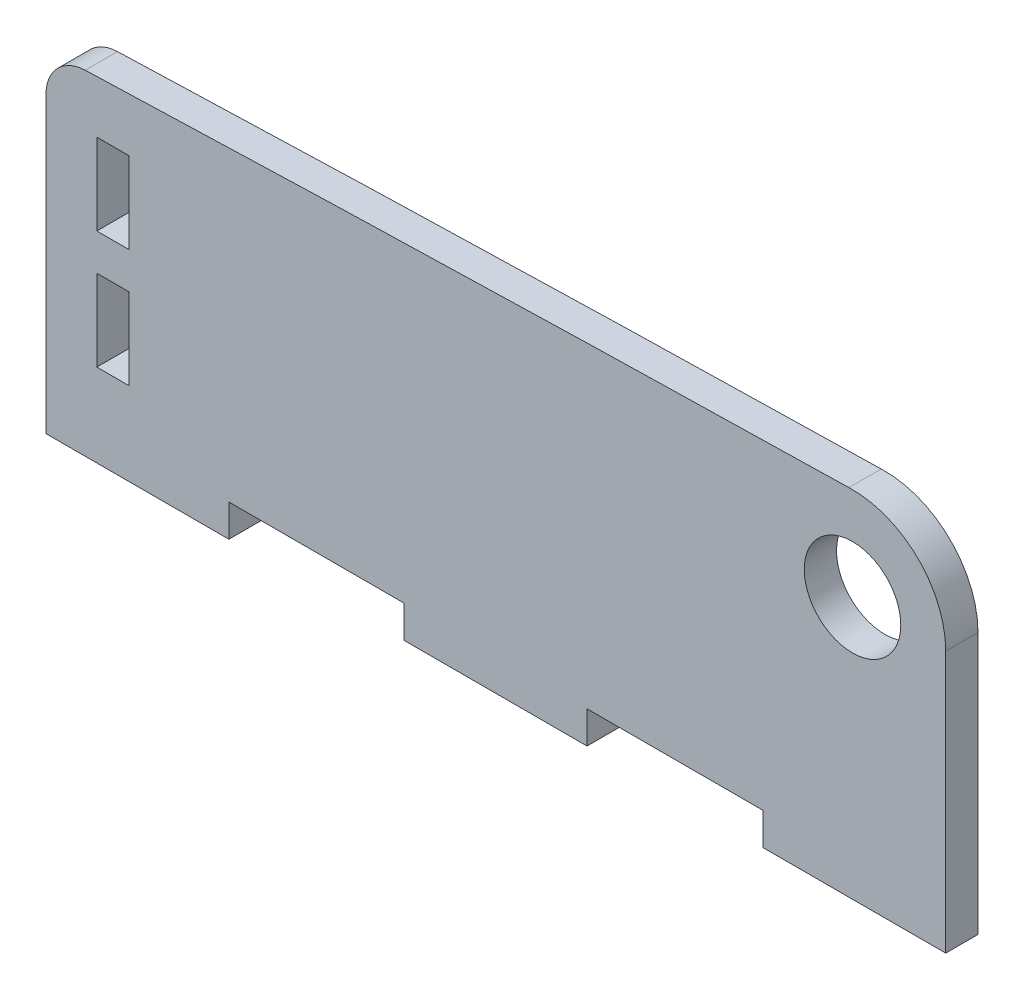
ISO-10303-21;
HEADER;
FILE_DESCRIPTION(('STEP AP214'),'2;1');
FILE_NAME('part.step','',(''),(''),'','','');
FILE_SCHEMA(('AUTOMOTIVE_DESIGN { 1 0 10303 214 1 1 1 1 }'));
ENDSEC;
DATA;
#1=APPLICATION_CONTEXT('core data for automotive mechanical design processes');
#2=APPLICATION_PROTOCOL_DEFINITION('international standard','automotive_design',2000,#1);
#3=PRODUCT_CONTEXT('',#1,'mechanical');
#4=PRODUCT('Part','Part','',(#3));
#5=PRODUCT_RELATED_PRODUCT_CATEGORY('part','',(#4));
#6=PRODUCT_DEFINITION_FORMATION('','',#4);
#7=PRODUCT_DEFINITION_CONTEXT('part definition',#1,'design');
#8=PRODUCT_DEFINITION('design','',#6,#7);
#9=PRODUCT_DEFINITION_SHAPE('','',#8);
#10=(LENGTH_UNIT() NAMED_UNIT(*) SI_UNIT(.MILLI.,.METRE.));
#11=(NAMED_UNIT(*) PLANE_ANGLE_UNIT() SI_UNIT($,.RADIAN.));
#12=(NAMED_UNIT(*) SI_UNIT($,.STERADIAN.) SOLID_ANGLE_UNIT());
#13=UNCERTAINTY_MEASURE_WITH_UNIT(LENGTH_MEASURE(1.E-05),#10,'distance_accuracy_value','');
#14=(GEOMETRIC_REPRESENTATION_CONTEXT(3) GLOBAL_UNCERTAINTY_ASSIGNED_CONTEXT((#13)) GLOBAL_UNIT_ASSIGNED_CONTEXT((#10,
#11,#12)) REPRESENTATION_CONTEXT('',''));
#15=CARTESIAN_POINT('',(0.,0.,0.));
#16=DIRECTION('',(0.,0.,1.));
#17=DIRECTION('',(1.,0.,0.));
#18=AXIS2_PLACEMENT_3D('',#15,#16,#17);
#19=CARTESIAN_POINT('',(26.416,-14.8,3.175));
#20=DIRECTION('',(0.,-1.,0.));
#21=DIRECTION('',(1.,0.,0.));
#22=AXIS2_PLACEMENT_3D('',#19,#20,#21);
#23=PLANE('',#22);
#24=DIRECTION('',(0.,0.,-1.));
#25=VECTOR('',#24,1.);
#26=CARTESIAN_POINT('',(-20.8,-14.8,21.4528725512572));
#27=LINE('',#26,#25);
#28=CARTESIAN_POINT('',(-20.8,-14.8,3.175));
#29=VERTEX_POINT('',#28);
#30=CARTESIAN_POINT('',(-20.8,-14.8,0.));
#31=VERTEX_POINT('',#30);
#32=EDGE_CURVE('E53',#29,#31,#27,.T.);
#33=ORIENTED_EDGE('',*,*,#32,.T.);
#34=DIRECTION('',(-1.,0.,0.));
#35=VECTOR('',#34,1.);
#36=CARTESIAN_POINT('',(26.416,-14.8,0.));
#37=LINE('',#36,#35);
#38=CARTESIAN_POINT('',(-3.55000000000001,-14.8,0.));
#39=VERTEX_POINT('',#38);
#40=EDGE_CURVE('E354',#39,#31,#37,.T.);
#41=ORIENTED_EDGE('',*,*,#40,.F.);
#42=DIRECTION('',(0.,0.,-1.));
#43=VECTOR('',#42,1.);
#44=CARTESIAN_POINT('',(-3.55000000000001,-14.8,21.4528725512572));
#45=LINE('',#44,#43);
#46=CARTESIAN_POINT('',(-3.55000000000001,-14.8,3.175));
#47=VERTEX_POINT('',#46);
#48=EDGE_CURVE('E230',#47,#39,#45,.T.);
#49=ORIENTED_EDGE('',*,*,#48,.F.);
#50=DIRECTION('',(-1.,0.,0.));
#51=VECTOR('',#50,1.);
#52=CARTESIAN_POINT('',(26.416,-14.8,3.175));
#53=LINE('',#52,#51);
#54=EDGE_CURVE('E58',#47,#29,#53,.T.);
#55=ORIENTED_EDGE('',*,*,#54,.T.);
#56=EDGE_LOOP('',(#33,#41,#49,#55));
#57=FACE_BOUND('',#56,.T.);
#58=ADVANCED_FACE('F38',(#57),#23,.T.);
#59=CARTESIAN_POINT('',(40.576,7.77,15.1599874843489));
#60=DIRECTION('',(0.,0.,-1.));
#61=DIRECTION('',(-1.,0.,0.));
#62=AXIS2_PLACEMENT_3D('',#59,#60,#61);
#63=CYLINDRICAL_SURFACE('',#62,9.17500000000001);
#64=CARTESIAN_POINT('',(40.576,7.77,0.));
#65=DIRECTION('',(0.,0.,-1.));
#66=DIRECTION('',(-1.,0.,0.));
#67=AXIS2_PLACEMENT_3D('',#64,#65,#66);
#68=CIRCLE('',#67,9.17500000000001);
#69=CARTESIAN_POINT('',(40.2258480765746,16.9383160193419,0.));
#70=VERTEX_POINT('',#69);
#71=CARTESIAN_POINT('',(49.751,7.77,0.));
#72=VERTEX_POINT('',#71);
#73=EDGE_CURVE('E340',#70,#72,#68,.T.);
#74=ORIENTED_EDGE('',*,*,#73,.F.);
#75=DIRECTION('',(0.,0.,-1.));
#76=VECTOR('',#75,1.);
#77=CARTESIAN_POINT('',(40.2258480765746,16.9383160193419,82.2297725290536));
#78=LINE('',#77,#76);
#79=CARTESIAN_POINT('',(40.2258480765746,16.9383160193419,3.175));
#80=VERTEX_POINT('',#79);
#81=EDGE_CURVE('E262',#80,#70,#78,.T.);
#82=ORIENTED_EDGE('',*,*,#81,.F.);
#83=CARTESIAN_POINT('',(40.576,7.77,3.175));
#84=DIRECTION('',(0.,0.,1.));
#85=DIRECTION('',(1.,0.,0.));
#86=AXIS2_PLACEMENT_3D('',#83,#84,#85);
#87=CIRCLE('',#86,9.17500000000001);
#88=CARTESIAN_POINT('',(49.751,7.77,3.175));
#89=VERTEX_POINT('',#88);
#90=EDGE_CURVE('E342',#80,#89,#87,.F.);
#91=ORIENTED_EDGE('',*,*,#90,.T.);
#92=DIRECTION('',(0.,0.,-1.));
#93=VECTOR('',#92,1.);
#94=CARTESIAN_POINT('',(49.751,7.77,10.));
#95=LINE('',#94,#93);
#96=EDGE_CURVE('E334',#89,#72,#95,.T.);
#97=ORIENTED_EDGE('',*,*,#96,.T.);
#98=EDGE_LOOP('',(#74,#82,#91,#97));
#99=FACE_BOUND('',#98,.T.);
#100=ADVANCED_FACE('F403',(#99),#63,.T.);
#101=CARTESIAN_POINT('',(-30.625,0.,33.0727537785032));
#102=DIRECTION('',(1.,0.,0.));
#103=DIRECTION('',(0.,1.,0.));
#104=AXIS2_PLACEMENT_3D('',#101,#102,#103);
#105=PLANE('',#104);
#106=DIRECTION('',(0.,0.,-1.));
#107=VECTOR('',#106,1.);
#108=CARTESIAN_POINT('',(-30.625,-9.79999999999999,33.8831524191867));
#109=LINE('',#108,#107);
#110=CARTESIAN_POINT('',(-30.625,-9.79999999999999,3.175));
#111=VERTEX_POINT('',#110);
#112=CARTESIAN_POINT('',(-30.625,-9.79999999999999,0.));
#113=VERTEX_POINT('',#112);
#114=EDGE_CURVE('E279',#111,#113,#109,.T.);
#115=ORIENTED_EDGE('',*,*,#114,.F.);
#116=DIRECTION('',(0.,-1.,0.));
#117=VECTOR('',#116,1.);
#118=CARTESIAN_POINT('',(-30.625,0.,3.175));
#119=LINE('',#118,#117);
#120=CARTESIAN_POINT('',(-30.625,-1.79999999999999,3.175));
#121=VERTEX_POINT('',#120);
#122=EDGE_CURVE('E328',#121,#111,#119,.T.);
#123=ORIENTED_EDGE('',*,*,#122,.F.);
#124=DIRECTION('',(0.,0.,-1.));
#125=VECTOR('',#124,1.);
#126=CARTESIAN_POINT('',(-30.625,-1.79999999999999,33.8831524191867));
#127=LINE('',#126,#125);
#128=CARTESIAN_POINT('',(-30.625,-1.79999999999999,0.));
#129=VERTEX_POINT('',#128);
#130=EDGE_CURVE('E317',#121,#129,#127,.T.);
#131=ORIENTED_EDGE('',*,*,#130,.T.);
#132=DIRECTION('',(0.,-1.,0.));
#133=VECTOR('',#132,1.);
#134=CARTESIAN_POINT('',(-30.625,0.,0.));
#135=LINE('',#134,#133);
#136=EDGE_CURVE('E306',#129,#113,#135,.T.);
#137=ORIENTED_EDGE('',*,*,#136,.T.);
#138=EDGE_LOOP('',(#115,#123,#131,#137));
#139=FACE_BOUND('',#138,.T.);
#140=ADVANCED_FACE('F405',(#139),#105,.F.);
#141=DIRECTION('',(0.,0.,-1.));
#142=VECTOR('',#141,1.);
#143=CARTESIAN_POINT('',(-30.625,1.8,33.8831524191867));
#144=LINE('',#143,#142);
#145=CARTESIAN_POINT('',(-30.625,1.8,3.175));
#146=VERTEX_POINT('',#145);
#147=CARTESIAN_POINT('',(-30.625,1.8,0.));
#148=VERTEX_POINT('',#147);
#149=EDGE_CURVE('E290',#146,#148,#144,.T.);
#150=ORIENTED_EDGE('',*,*,#149,.F.);
#151=CARTESIAN_POINT('',(-30.625,9.8,3.175));
#152=VERTEX_POINT('',#151);
#153=EDGE_CURVE('E331',#152,#146,#119,.T.);
#154=ORIENTED_EDGE('',*,*,#153,.F.);
#155=DIRECTION('',(0.,0.,-1.));
#156=VECTOR('',#155,1.);
#157=CARTESIAN_POINT('',(-30.625,9.8,33.8831524191867));
#158=LINE('',#157,#156);
#159=CARTESIAN_POINT('',(-30.625,9.8,0.));
#160=VERTEX_POINT('',#159);
#161=EDGE_CURVE('E296',#152,#160,#158,.T.);
#162=ORIENTED_EDGE('',*,*,#161,.T.);
#163=EDGE_CURVE('E327',#160,#148,#135,.T.);
#164=ORIENTED_EDGE('',*,*,#163,.T.);
#165=EDGE_LOOP('',(#150,#154,#162,#164));
#166=FACE_BOUND('',#165,.T.);
#167=ADVANCED_FACE('F411',(#166),#105,.F.);
#168=CARTESIAN_POINT('',(0.,0.,0.));
#169=DIRECTION('',(0.,0.,1.));
#170=DIRECTION('',(1.,0.,0.));
#171=AXIS2_PLACEMENT_3D('',#168,#169,#170);
#172=PLANE('',#171);
#173=DIRECTION('',(-1.,0.,0.));
#174=VECTOR('',#173,1.);
#175=CARTESIAN_POINT('',(0.,-9.79999999999999,0.));
#176=LINE('',#175,#174);
#177=CARTESIAN_POINT('',(-33.8,-9.79999999999999,0.));
#178=VERTEX_POINT('',#177);
#179=EDGE_CURVE('E275',#113,#178,#176,.T.);
#180=ORIENTED_EDGE('',*,*,#179,.F.);
#181=ORIENTED_EDGE('',*,*,#136,.F.);
#182=DIRECTION('',(-1.,0.,0.));
#183=VECTOR('',#182,1.);
#184=CARTESIAN_POINT('',(0.,-1.79999999999999,0.));
#185=LINE('',#184,#183);
#186=CARTESIAN_POINT('',(-33.8,-1.79999999999999,0.));
#187=VERTEX_POINT('',#186);
#188=EDGE_CURVE('E282',#129,#187,#185,.T.);
#189=ORIENTED_EDGE('',*,*,#188,.T.);
#190=DIRECTION('',(0.,-1.,0.));
#191=VECTOR('',#190,1.);
#192=CARTESIAN_POINT('',(-33.8,0.,0.));
#193=LINE('',#192,#191);
#194=EDGE_CURVE('E197',#187,#178,#193,.T.);
#195=ORIENTED_EDGE('',*,*,#194,.T.);
#196=EDGE_LOOP('',(#180,#181,#189,#195));
#197=FACE_BOUND('',#196,.T.);
#198=DIRECTION('',(-1.,0.,0.));
#199=VECTOR('',#198,1.);
#200=CARTESIAN_POINT('',(0.,1.8,0.));
#201=LINE('',#200,#199);
#202=CARTESIAN_POINT('',(-33.8,1.8,0.));
#203=VERTEX_POINT('',#202);
#204=EDGE_CURVE('E286',#148,#203,#201,.T.);
#205=ORIENTED_EDGE('',*,*,#204,.F.);
#206=ORIENTED_EDGE('',*,*,#163,.F.);
#207=DIRECTION('',(-1.,0.,0.));
#208=VECTOR('',#207,1.);
#209=CARTESIAN_POINT('',(0.,9.8,0.));
#210=LINE('',#209,#208);
#211=CARTESIAN_POINT('',(-33.8,9.8,0.));
#212=VERTEX_POINT('',#211);
#213=EDGE_CURVE('E293',#160,#212,#210,.T.);
#214=ORIENTED_EDGE('',*,*,#213,.T.);
#215=DIRECTION('',(0.,-1.,0.));
#216=VECTOR('',#215,1.);
#217=CARTESIAN_POINT('',(-33.8,0.,0.));
#218=LINE('',#217,#216);
#219=EDGE_CURVE('E285',#212,#203,#218,.T.);
#220=ORIENTED_EDGE('',*,*,#219,.T.);
#221=EDGE_LOOP('',(#205,#206,#214,#220));
#222=FACE_BOUND('',#221,.T.);
#223=CARTESIAN_POINT('',(40.576,7.77,0.));
#224=DIRECTION('',(0.,0.,-1.));
#225=DIRECTION('',(-1.,0.,0.));
#226=AXIS2_PLACEMENT_3D('',#223,#224,#225);
#227=CIRCLE('',#226,4.75);
#228=CARTESIAN_POINT('',(35.826,7.77,0.));
#229=VERTEX_POINT('',#228);
#230=EDGE_CURVE('E344',#229,#229,#227,.T.);
#231=ORIENTED_EDGE('',*,*,#230,.F.);
#232=EDGE_LOOP('',(#231));
#233=FACE_BOUND('',#232,.T.);
#234=DIRECTION('',(0.,-1.,0.));
#235=VECTOR('',#234,1.);
#236=CARTESIAN_POINT('',(-38.8,0.,0.));
#237=LINE('',#236,#235);
#238=CARTESIAN_POINT('',(-38.8,10.9360380146031,0.));
#239=VERTEX_POINT('',#238);
#240=CARTESIAN_POINT('',(-38.8,-17.975,0.));
#241=VERTEX_POINT('',#240);
#242=EDGE_CURVE('E203',#239,#241,#237,.T.);
#243=ORIENTED_EDGE('',*,*,#242,.F.);
#244=CARTESIAN_POINT('',(-34.8,10.9360380146031,0.));
#245=DIRECTION('',(0.,0.,1.));
#246=DIRECTION('',(1.,0.,0.));
#247=AXIS2_PLACEMENT_3D('',#244,#245,#246);
#248=CIRCLE('',#247,4.);
#249=CARTESIAN_POINT('',(-34.9367995007202,14.9336980672583,0.));
#250=VERTEX_POINT('',#249);
#251=EDGE_CURVE('E358',#239,#250,#248,.F.);
#252=ORIENTED_EDGE('',*,*,#251,.T.);
#253=CARTESIAN_POINT('',(135.530776045635,-4966.60068946307,0.));
#254=DIRECTION('',(0.,0.,-1.));
#255=DIRECTION('',(-1.,0.,0.));
#256=AXIS2_PLACEMENT_3D('',#253,#254,#255);
#257=CIRCLE('',#256,4984.45022529665);
#258=EDGE_CURVE('E269',#70,#250,#257,.F.);
#259=ORIENTED_EDGE('',*,*,#258,.F.);
#260=ORIENTED_EDGE('',*,*,#73,.T.);
#261=DIRECTION('',(0.,-1.,0.));
#262=VECTOR('',#261,1.);
#263=CARTESIAN_POINT('',(49.751,0.,0.));
#264=LINE('',#263,#262);
#265=CARTESIAN_POINT('',(49.751,-17.975,0.));
#266=VERTEX_POINT('',#265);
#267=EDGE_CURVE('E332',#72,#266,#264,.T.);
#268=ORIENTED_EDGE('',*,*,#267,.T.);
#269=DIRECTION('',(-1.,0.,0.));
#270=VECTOR('',#269,1.);
#271=CARTESIAN_POINT('',(49.751,-17.975,0.));
#272=LINE('',#271,#270);
#273=CARTESIAN_POINT('',(31.751,-17.975,0.));
#274=VERTEX_POINT('',#273);
#275=EDGE_CURVE('E252',#266,#274,#272,.T.);
#276=ORIENTED_EDGE('',*,*,#275,.T.);
#277=DIRECTION('',(0.,-1.,0.));
#278=VECTOR('',#277,1.);
#279=CARTESIAN_POINT('',(31.751,-14.8,0.));
#280=LINE('',#279,#278);
#281=CARTESIAN_POINT('',(31.751,-14.8,0.));
#282=VERTEX_POINT('',#281);
#283=EDGE_CURVE('E249',#282,#274,#280,.T.);
#284=ORIENTED_EDGE('',*,*,#283,.F.);
#285=CARTESIAN_POINT('',(14.45,-14.8,0.));
#286=VERTEX_POINT('',#285);
#287=EDGE_CURVE('E351',#282,#286,#37,.T.);
#288=ORIENTED_EDGE('',*,*,#287,.T.);
#289=DIRECTION('',(0.,-1.,0.));
#290=VECTOR('',#289,1.);
#291=CARTESIAN_POINT('',(14.45,-14.8,0.));
#292=LINE('',#291,#290);
#293=CARTESIAN_POINT('',(14.45,-17.975,0.));
#294=VERTEX_POINT('',#293);
#295=EDGE_CURVE('E215',#286,#294,#292,.T.);
#296=ORIENTED_EDGE('',*,*,#295,.T.);
#297=DIRECTION('',(-1.,0.,0.));
#298=VECTOR('',#297,1.);
#299=CARTESIAN_POINT('',(14.45,-17.975,0.));
#300=LINE('',#299,#298);
#301=CARTESIAN_POINT('',(-3.55000000000001,-17.975,0.));
#302=VERTEX_POINT('',#301);
#303=EDGE_CURVE('E242',#294,#302,#300,.T.);
#304=ORIENTED_EDGE('',*,*,#303,.T.);
#305=DIRECTION('',(0.,-1.,0.));
#306=VECTOR('',#305,1.);
#307=CARTESIAN_POINT('',(-3.55000000000001,-14.8,0.));
#308=LINE('',#307,#306);
#309=EDGE_CURVE('E234',#39,#302,#308,.T.);
#310=ORIENTED_EDGE('',*,*,#309,.F.);
#311=ORIENTED_EDGE('',*,*,#40,.T.);
#312=DIRECTION('',(0.,-1.,0.));
#313=VECTOR('',#312,1.);
#314=CARTESIAN_POINT('',(-20.8,-14.8,0.));
#315=LINE('',#314,#313);
#316=CARTESIAN_POINT('',(-20.8,-17.975,0.));
#317=VERTEX_POINT('',#316);
#318=EDGE_CURVE('E223',#31,#317,#315,.T.);
#319=ORIENTED_EDGE('',*,*,#318,.T.);
#320=DIRECTION('',(-1.,0.,0.));
#321=VECTOR('',#320,1.);
#322=CARTESIAN_POINT('',(-20.8,-17.975,0.));
#323=LINE('',#322,#321);
#324=EDGE_CURVE('E221',#317,#241,#323,.T.);
#325=ORIENTED_EDGE('',*,*,#324,.T.);
#326=EDGE_LOOP('',(#243,#252,#259,#260,#268,#276,#284,#288,#296,#304,#310,#311,#319,#325));
#327=FACE_BOUND('',#326,.T.);
#328=ADVANCED_FACE('F367',(#197,#222,#233,#327),#172,.F.);
#329=CARTESIAN_POINT('',(0.,0.,3.175));
#330=DIRECTION('',(0.,0.,1.));
#331=DIRECTION('',(1.,0.,0.));
#332=AXIS2_PLACEMENT_3D('',#329,#330,#331);
#333=PLANE('',#332);
#334=DIRECTION('',(-1.,0.,0.));
#335=VECTOR('',#334,1.);
#336=CARTESIAN_POINT('',(0.,9.8,3.175));
#337=LINE('',#336,#335);
#338=CARTESIAN_POINT('',(-33.8,9.8,3.175));
#339=VERTEX_POINT('',#338);
#340=EDGE_CURVE('E298',#152,#339,#337,.T.);
#341=ORIENTED_EDGE('',*,*,#340,.F.);
#342=ORIENTED_EDGE('',*,*,#153,.T.);
#343=DIRECTION('',(-1.,0.,0.));
#344=VECTOR('',#343,1.);
#345=CARTESIAN_POINT('',(0.,1.8,3.175));
#346=LINE('',#345,#344);
#347=CARTESIAN_POINT('',(-33.8,1.8,3.175));
#348=VERTEX_POINT('',#347);
#349=EDGE_CURVE('E303',#146,#348,#346,.T.);
#350=ORIENTED_EDGE('',*,*,#349,.T.);
#351=DIRECTION('',(0.,-1.,0.));
#352=VECTOR('',#351,1.);
#353=CARTESIAN_POINT('',(-33.8,0.,3.175));
#354=LINE('',#353,#352);
#355=EDGE_CURVE('E289',#339,#348,#354,.T.);
#356=ORIENTED_EDGE('',*,*,#355,.F.);
#357=EDGE_LOOP('',(#341,#342,#350,#356));
#358=FACE_BOUND('',#357,.T.);
#359=CARTESIAN_POINT('',(135.530776045635,-4966.60068946307,3.175));
#360=DIRECTION('',(0.,0.,1.));
#361=DIRECTION('',(1.,0.,0.));
#362=AXIS2_PLACEMENT_3D('',#359,#360,#361);
#363=CIRCLE('',#362,4984.45022529665);
#364=CARTESIAN_POINT('',(-34.9367995007202,14.9336980672583,3.175));
#365=VERTEX_POINT('',#364);
#366=EDGE_CURVE('E272',#80,#365,#363,.T.);
#367=ORIENTED_EDGE('',*,*,#366,.T.);
#368=CARTESIAN_POINT('',(-34.8,10.9360380146031,3.175));
#369=DIRECTION('',(0.,0.,1.));
#370=DIRECTION('',(1.,0.,0.));
#371=AXIS2_PLACEMENT_3D('',#368,#369,#370);
#372=CIRCLE('',#371,4.);
#373=CARTESIAN_POINT('',(-38.8,10.9360380146031,3.175));
#374=VERTEX_POINT('',#373);
#375=EDGE_CURVE('E11',#365,#374,#372,.T.);
#376=ORIENTED_EDGE('',*,*,#375,.T.);
#377=DIRECTION('',(0.,-1.,0.));
#378=VECTOR('',#377,1.);
#379=CARTESIAN_POINT('',(-38.8,0.,3.175));
#380=LINE('',#379,#378);
#381=CARTESIAN_POINT('',(-38.8,-17.975,3.175));
#382=VERTEX_POINT('',#381);
#383=EDGE_CURVE('E184',#374,#382,#380,.T.);
#384=ORIENTED_EDGE('',*,*,#383,.T.);
#385=DIRECTION('',(-1.,0.,0.));
#386=VECTOR('',#385,1.);
#387=CARTESIAN_POINT('',(-20.8,-17.975,3.175));
#388=LINE('',#387,#386);
#389=CARTESIAN_POINT('',(-20.8,-17.975,3.175));
#390=VERTEX_POINT('',#389);
#391=EDGE_CURVE('E191',#390,#382,#388,.T.);
#392=ORIENTED_EDGE('',*,*,#391,.F.);
#393=DIRECTION('',(0.,-1.,0.));
#394=VECTOR('',#393,1.);
#395=CARTESIAN_POINT('',(-20.8,-14.8,3.175));
#396=LINE('',#395,#394);
#397=EDGE_CURVE('E207',#29,#390,#396,.T.);
#398=ORIENTED_EDGE('',*,*,#397,.F.);
#399=ORIENTED_EDGE('',*,*,#54,.F.);
#400=DIRECTION('',(0.,-1.,0.));
#401=VECTOR('',#400,1.);
#402=CARTESIAN_POINT('',(-3.55000000000001,-14.8,3.175));
#403=LINE('',#402,#401);
#404=CARTESIAN_POINT('',(-3.55000000000001,-17.975,3.175));
#405=VERTEX_POINT('',#404);
#406=EDGE_CURVE('E212',#47,#405,#403,.T.);
#407=ORIENTED_EDGE('',*,*,#406,.T.);
#408=DIRECTION('',(-1.,0.,0.));
#409=VECTOR('',#408,1.);
#410=CARTESIAN_POINT('',(14.45,-17.975,3.175));
#411=LINE('',#410,#409);
#412=CARTESIAN_POINT('',(14.45,-17.975,3.175));
#413=VERTEX_POINT('',#412);
#414=EDGE_CURVE('E228',#413,#405,#411,.T.);
#415=ORIENTED_EDGE('',*,*,#414,.F.);
#416=DIRECTION('',(0.,-1.,0.));
#417=VECTOR('',#416,1.);
#418=CARTESIAN_POINT('',(14.45,-14.8,3.175));
#419=LINE('',#418,#417);
#420=CARTESIAN_POINT('',(14.45,-14.8,3.175));
#421=VERTEX_POINT('',#420);
#422=EDGE_CURVE('E229',#421,#413,#419,.T.);
#423=ORIENTED_EDGE('',*,*,#422,.F.);
#424=CARTESIAN_POINT('',(31.751,-14.8,3.175));
#425=VERTEX_POINT('',#424);
#426=EDGE_CURVE('E348',#425,#421,#53,.T.);
#427=ORIENTED_EDGE('',*,*,#426,.F.);
#428=DIRECTION('',(0.,-1.,0.));
#429=VECTOR('',#428,1.);
#430=CARTESIAN_POINT('',(31.751,-14.8,3.175));
#431=LINE('',#430,#429);
#432=CARTESIAN_POINT('',(31.751,-17.975,3.175));
#433=VERTEX_POINT('',#432);
#434=EDGE_CURVE('E256',#425,#433,#431,.T.);
#435=ORIENTED_EDGE('',*,*,#434,.T.);
#436=DIRECTION('',(-1.,0.,0.));
#437=VECTOR('',#436,1.);
#438=CARTESIAN_POINT('',(49.751,-17.975,3.175));
#439=LINE('',#438,#437);
#440=CARTESIAN_POINT('',(49.751,-17.975,3.175));
#441=VERTEX_POINT('',#440);
#442=EDGE_CURVE('E240',#441,#433,#439,.T.);
#443=ORIENTED_EDGE('',*,*,#442,.F.);
#444=DIRECTION('',(0.,1.,0.));
#445=VECTOR('',#444,1.);
#446=CARTESIAN_POINT('',(49.751,0.,3.175));
#447=LINE('',#446,#445);
#448=EDGE_CURVE('E337',#441,#89,#447,.T.);
#449=ORIENTED_EDGE('',*,*,#448,.T.);
#450=ORIENTED_EDGE('',*,*,#90,.F.);
#451=EDGE_LOOP('',(#367,#376,#384,#392,#398,#399,#407,#415,#423,#427,#435,#443,#449,#450));
#452=FACE_BOUND('',#451,.T.);
#453=CARTESIAN_POINT('',(40.576,7.77,3.175));
#454=DIRECTION('',(0.,0.,1.));
#455=DIRECTION('',(1.,0.,0.));
#456=AXIS2_PLACEMENT_3D('',#453,#454,#455);
#457=CIRCLE('',#456,4.75);
#458=CARTESIAN_POINT('',(45.326,7.77,3.175));
#459=VERTEX_POINT('',#458);
#460=EDGE_CURVE('E347',#459,#459,#457,.T.);
#461=ORIENTED_EDGE('',*,*,#460,.F.);
#462=EDGE_LOOP('',(#461));
#463=FACE_BOUND('',#462,.T.);
#464=DIRECTION('',(-1.,0.,0.));
#465=VECTOR('',#464,1.);
#466=CARTESIAN_POINT('',(0.,-1.79999999999999,3.175));
#467=LINE('',#466,#465);
#468=CARTESIAN_POINT('',(-33.8,-1.79999999999999,3.175));
#469=VERTEX_POINT('',#468);
#470=EDGE_CURVE('E307',#121,#469,#467,.T.);
#471=ORIENTED_EDGE('',*,*,#470,.F.);
#472=ORIENTED_EDGE('',*,*,#122,.T.);
#473=DIRECTION('',(-1.,0.,0.));
#474=VECTOR('',#473,1.);
#475=CARTESIAN_POINT('',(0.,-9.79999999999999,3.175));
#476=LINE('',#475,#474);
#477=CARTESIAN_POINT('',(-33.8,-9.79999999999999,3.175));
#478=VERTEX_POINT('',#477);
#479=EDGE_CURVE('E196',#111,#478,#476,.T.);
#480=ORIENTED_EDGE('',*,*,#479,.T.);
#481=DIRECTION('',(0.,-1.,0.));
#482=VECTOR('',#481,1.);
#483=CARTESIAN_POINT('',(-33.8,0.,3.175));
#484=LINE('',#483,#482);
#485=EDGE_CURVE('E278',#469,#478,#484,.T.);
#486=ORIENTED_EDGE('',*,*,#485,.F.);
#487=EDGE_LOOP('',(#471,#472,#480,#486));
#488=FACE_BOUND('',#487,.T.);
#489=ADVANCED_FACE('F187',(#358,#452,#463,#488),#333,.T.);
#490=DIRECTION('',(0.,0.,-1.));
#491=VECTOR('',#490,1.);
#492=CARTESIAN_POINT('',(14.45,-14.8,21.4528725512572));
#493=LINE('',#492,#491);
#494=EDGE_CURVE('E233',#421,#286,#493,.T.);
#495=ORIENTED_EDGE('',*,*,#494,.T.);
#496=ORIENTED_EDGE('',*,*,#287,.F.);
#497=DIRECTION('',(0.,0.,-1.));
#498=VECTOR('',#497,1.);
#499=CARTESIAN_POINT('',(31.751,-14.8,21.4528725512572));
#500=LINE('',#499,#498);
#501=EDGE_CURVE('E253',#425,#282,#500,.T.);
#502=ORIENTED_EDGE('',*,*,#501,.F.);
#503=ORIENTED_EDGE('',*,*,#426,.T.);
#504=EDGE_LOOP('',(#495,#496,#502,#503));
#505=FACE_BOUND('',#504,.T.);
#506=ADVANCED_FACE('F388',(#505),#23,.T.);
#507=CARTESIAN_POINT('',(40.576,7.77,10.));
#508=DIRECTION('',(0.,0.,-1.));
#509=DIRECTION('',(-1.,0.,0.));
#510=AXIS2_PLACEMENT_3D('',#507,#508,#509);
#511=CYLINDRICAL_SURFACE('',#510,4.75);
#512=ORIENTED_EDGE('',*,*,#460,.T.);
#513=EDGE_LOOP('',(#512));
#514=FACE_BOUND('',#513,.T.);
#515=ORIENTED_EDGE('',*,*,#230,.T.);
#516=EDGE_LOOP('',(#515));
#517=FACE_BOUND('',#516,.T.);
#518=ADVANCED_FACE('F416',(#514,#517),#511,.F.);
#519=CARTESIAN_POINT('',(49.751,0.,10.));
#520=DIRECTION('',(1.,0.,0.));
#521=DIRECTION('',(0.,0.,-1.));
#522=AXIS2_PLACEMENT_3D('',#519,#520,#521);
#523=PLANE('',#522);
#524=ORIENTED_EDGE('',*,*,#448,.F.);
#525=DIRECTION('',(0.,0.,-1.));
#526=VECTOR('',#525,1.);
#527=CARTESIAN_POINT('',(49.751,-17.975,21.4528725512572));
#528=LINE('',#527,#526);
#529=EDGE_CURVE('E263',#441,#266,#528,.T.);
#530=ORIENTED_EDGE('',*,*,#529,.T.);
#531=ORIENTED_EDGE('',*,*,#267,.F.);
#532=ORIENTED_EDGE('',*,*,#96,.F.);
#533=EDGE_LOOP('',(#524,#530,#531,#532));
#534=FACE_BOUND('',#533,.T.);
#535=ADVANCED_FACE('F399',(#534),#523,.T.);
#536=CARTESIAN_POINT('',(-38.8,0.,33.8831524191867));
#537=DIRECTION('',(1.,0.,0.));
#538=DIRECTION('',(0.,1.,0.));
#539=AXIS2_PLACEMENT_3D('',#536,#537,#538);
#540=PLANE('',#539);
#541=ORIENTED_EDGE('',*,*,#383,.F.);
#542=DIRECTION('',(0.,0.,-1.));
#543=VECTOR('',#542,1.);
#544=CARTESIAN_POINT('',(-38.8,10.9360380146031,33.8831524191867));
#545=LINE('',#544,#543);
#546=EDGE_CURVE('E350',#374,#239,#545,.T.);
#547=ORIENTED_EDGE('',*,*,#546,.T.);
#548=ORIENTED_EDGE('',*,*,#242,.T.);
#549=DIRECTION('',(0.,0.,-1.));
#550=VECTOR('',#549,1.);
#551=CARTESIAN_POINT('',(-38.8,-17.975,21.4528725512572));
#552=LINE('',#551,#550);
#553=EDGE_CURVE('E200',#382,#241,#552,.T.);
#554=ORIENTED_EDGE('',*,*,#553,.F.);
#555=EDGE_LOOP('',(#541,#547,#548,#554));
#556=FACE_BOUND('',#555,.T.);
#557=ADVANCED_FACE('F201',(#556),#540,.F.);
#558=CARTESIAN_POINT('',(0.,-9.79999999999999,33.8831524191867));
#559=DIRECTION('',(0.,-1.,0.));
#560=DIRECTION('',(0.,0.,-1.));
#561=AXIS2_PLACEMENT_3D('',#558,#559,#560);
#562=PLANE('',#561);
#563=ORIENTED_EDGE('',*,*,#479,.F.);
#564=ORIENTED_EDGE('',*,*,#114,.T.);
#565=ORIENTED_EDGE('',*,*,#179,.T.);
#566=DIRECTION('',(0.,0.,-1.));
#567=VECTOR('',#566,1.);
#568=CARTESIAN_POINT('',(-33.8,-9.79999999999999,33.8831524191867));
#569=LINE('',#568,#567);
#570=EDGE_CURVE('E310',#478,#178,#569,.T.);
#571=ORIENTED_EDGE('',*,*,#570,.F.);
#572=EDGE_LOOP('',(#563,#564,#565,#571));
#573=FACE_BOUND('',#572,.T.);
#574=ADVANCED_FACE('F447',(#573),#562,.F.);
#575=CARTESIAN_POINT('',(-33.8,0.,33.8831524191867));
#576=DIRECTION('',(1.,0.,0.));
#577=DIRECTION('',(0.,0.,-1.));
#578=AXIS2_PLACEMENT_3D('',#575,#576,#577);
#579=PLANE('',#578);
#580=DIRECTION('',(0.,0.,-1.));
#581=VECTOR('',#580,1.);
#582=CARTESIAN_POINT('',(-33.8,-1.79999999999999,33.8831524191867));
#583=LINE('',#582,#581);
#584=EDGE_CURVE('E309',#469,#187,#583,.T.);
#585=ORIENTED_EDGE('',*,*,#584,.F.);
#586=ORIENTED_EDGE('',*,*,#485,.T.);
#587=ORIENTED_EDGE('',*,*,#570,.T.);
#588=ORIENTED_EDGE('',*,*,#194,.F.);
#589=EDGE_LOOP('',(#585,#586,#587,#588));
#590=FACE_BOUND('',#589,.T.);
#591=ADVANCED_FACE('F455',(#590),#579,.T.);
#592=CARTESIAN_POINT('',(0.,-1.79999999999999,33.8831524191867));
#593=DIRECTION('',(0.,-1.,0.));
#594=DIRECTION('',(0.,0.,-1.));
#595=AXIS2_PLACEMENT_3D('',#592,#593,#594);
#596=PLANE('',#595);
#597=ORIENTED_EDGE('',*,*,#130,.F.);
#598=ORIENTED_EDGE('',*,*,#470,.T.);
#599=ORIENTED_EDGE('',*,*,#584,.T.);
#600=ORIENTED_EDGE('',*,*,#188,.F.);
#601=EDGE_LOOP('',(#597,#598,#599,#600));
#602=FACE_BOUND('',#601,.T.);
#603=ADVANCED_FACE('F464',(#602),#596,.T.);
#604=CARTESIAN_POINT('',(0.,1.8,33.8831524191867));
#605=DIRECTION('',(0.,-1.,0.));
#606=DIRECTION('',(1.,0.,0.));
#607=AXIS2_PLACEMENT_3D('',#604,#605,#606);
#608=PLANE('',#607);
#609=ORIENTED_EDGE('',*,*,#349,.F.);
#610=ORIENTED_EDGE('',*,*,#149,.T.);
#611=ORIENTED_EDGE('',*,*,#204,.T.);
#612=DIRECTION('',(0.,0.,-1.));
#613=VECTOR('',#612,1.);
#614=CARTESIAN_POINT('',(-33.8,1.8,33.8831524191867));
#615=LINE('',#614,#613);
#616=EDGE_CURVE('E301',#348,#203,#615,.T.);
#617=ORIENTED_EDGE('',*,*,#616,.F.);
#618=EDGE_LOOP('',(#609,#610,#611,#617));
#619=FACE_BOUND('',#618,.T.);
#620=ADVANCED_FACE('F472',(#619),#608,.F.);
#621=CARTESIAN_POINT('',(-33.8,0.,33.8831524191867));
#622=DIRECTION('',(1.,0.,0.));
#623=DIRECTION('',(0.,0.,-1.));
#624=AXIS2_PLACEMENT_3D('',#621,#622,#623);
#625=PLANE('',#624);
#626=DIRECTION('',(0.,0.,-1.));
#627=VECTOR('',#626,1.);
#628=CARTESIAN_POINT('',(-33.8,9.8,33.8831524191867));
#629=LINE('',#628,#627);
#630=EDGE_CURVE('E300',#339,#212,#629,.T.);
#631=ORIENTED_EDGE('',*,*,#630,.F.);
#632=ORIENTED_EDGE('',*,*,#355,.T.);
#633=ORIENTED_EDGE('',*,*,#616,.T.);
#634=ORIENTED_EDGE('',*,*,#219,.F.);
#635=EDGE_LOOP('',(#631,#632,#633,#634));
#636=FACE_BOUND('',#635,.T.);
#637=ADVANCED_FACE('F480',(#636),#625,.T.);
#638=CARTESIAN_POINT('',(0.,9.8,33.8831524191867));
#639=DIRECTION('',(0.,-1.,0.));
#640=DIRECTION('',(0.,0.,-1.));
#641=AXIS2_PLACEMENT_3D('',#638,#639,#640);
#642=PLANE('',#641);
#643=ORIENTED_EDGE('',*,*,#161,.F.);
#644=ORIENTED_EDGE('',*,*,#340,.T.);
#645=ORIENTED_EDGE('',*,*,#630,.T.);
#646=ORIENTED_EDGE('',*,*,#213,.F.);
#647=EDGE_LOOP('',(#643,#644,#645,#646));
#648=FACE_BOUND('',#647,.T.);
#649=ADVANCED_FACE('F488',(#648),#642,.T.);
#650=CARTESIAN_POINT('',(135.530776045635,-4966.60068946307,82.2297725290536));
#651=DIRECTION('',(0.,0.,-1.));
#652=DIRECTION('',(-1.,0.,0.));
#653=AXIS2_PLACEMENT_3D('',#650,#651,#652);
#654=CYLINDRICAL_SURFACE('',#653,4984.45022529665);
#655=ORIENTED_EDGE('',*,*,#258,.T.);
#656=DIRECTION('',(0.,0.,-1.));
#657=VECTOR('',#656,1.);
#658=CARTESIAN_POINT('',(-34.9367995007202,14.9336980672592,82.2297725290536));
#659=LINE('',#658,#657);
#660=EDGE_CURVE('E46',#250,#365,#659,.F.);
#661=ORIENTED_EDGE('',*,*,#660,.T.);
#662=ORIENTED_EDGE('',*,*,#366,.F.);
#663=ORIENTED_EDGE('',*,*,#81,.T.);
#664=EDGE_LOOP('',(#655,#661,#662,#663));
#665=FACE_BOUND('',#664,.T.);
#666=ADVANCED_FACE('F361',(#665),#654,.T.);
#667=CARTESIAN_POINT('',(-34.8,10.9360380146031,82.2297725290536));
#668=DIRECTION('',(0.,0.,-1.));
#669=DIRECTION('',(-1.,0.,0.));
#670=AXIS2_PLACEMENT_3D('',#667,#668,#669);
#671=CYLINDRICAL_SURFACE('',#670,4.);
#672=ORIENTED_EDGE('',*,*,#375,.F.);
#673=ORIENTED_EDGE('',*,*,#660,.F.);
#674=ORIENTED_EDGE('',*,*,#251,.F.);
#675=ORIENTED_EDGE('',*,*,#546,.F.);
#676=EDGE_LOOP('',(#672,#673,#674,#675));
#677=FACE_BOUND('',#676,.T.);
#678=ADVANCED_FACE('F40',(#677),#671,.T.);
#679=CARTESIAN_POINT('',(49.751,-17.975,21.4528725512572));
#680=DIRECTION('',(0.,-1.,0.));
#681=DIRECTION('',(0.,0.,-1.));
#682=AXIS2_PLACEMENT_3D('',#679,#680,#681);
#683=PLANE('',#682);
#684=ORIENTED_EDGE('',*,*,#529,.F.);
#685=ORIENTED_EDGE('',*,*,#442,.T.);
#686=DIRECTION('',(0.,0.,-1.));
#687=VECTOR('',#686,1.);
#688=CARTESIAN_POINT('',(31.751,-17.975,21.4528725512572));
#689=LINE('',#688,#687);
#690=EDGE_CURVE('E259',#433,#274,#689,.T.);
#691=ORIENTED_EDGE('',*,*,#690,.T.);
#692=ORIENTED_EDGE('',*,*,#275,.F.);
#693=EDGE_LOOP('',(#684,#685,#691,#692));
#694=FACE_BOUND('',#693,.T.);
#695=ADVANCED_FACE('F396',(#694),#683,.T.);
#696=CARTESIAN_POINT('',(31.751,-14.8,21.4528725512572));
#697=DIRECTION('',(1.,0.,0.));
#698=DIRECTION('',(0.,0.,-1.));
#699=AXIS2_PLACEMENT_3D('',#696,#697,#698);
#700=PLANE('',#699);
#701=ORIENTED_EDGE('',*,*,#434,.F.);
#702=ORIENTED_EDGE('',*,*,#501,.T.);
#703=ORIENTED_EDGE('',*,*,#283,.T.);
#704=ORIENTED_EDGE('',*,*,#690,.F.);
#705=EDGE_LOOP('',(#701,#702,#703,#704));
#706=FACE_BOUND('',#705,.T.);
#707=ADVANCED_FACE('F392',(#706),#700,.F.);
#708=CARTESIAN_POINT('',(14.45,-17.975,21.4528725512572));
#709=DIRECTION('',(0.,-1.,0.));
#710=DIRECTION('',(0.,0.,-1.));
#711=AXIS2_PLACEMENT_3D('',#708,#709,#710);
#712=PLANE('',#711);
#713=DIRECTION('',(0.,0.,-1.));
#714=VECTOR('',#713,1.);
#715=CARTESIAN_POINT('',(14.45,-17.975,21.4528725512572));
#716=LINE('',#715,#714);
#717=EDGE_CURVE('E236',#413,#294,#716,.T.);
#718=ORIENTED_EDGE('',*,*,#717,.F.);
#719=ORIENTED_EDGE('',*,*,#414,.T.);
#720=DIRECTION('',(0.,0.,-1.));
#721=VECTOR('',#720,1.);
#722=CARTESIAN_POINT('',(-3.55000000000001,-17.975,21.4528725512572));
#723=LINE('',#722,#721);
#724=EDGE_CURVE('E226',#405,#302,#723,.T.);
#725=ORIENTED_EDGE('',*,*,#724,.T.);
#726=ORIENTED_EDGE('',*,*,#303,.F.);
#727=EDGE_LOOP('',(#718,#719,#725,#726));
#728=FACE_BOUND('',#727,.T.);
#729=ADVANCED_FACE('F379',(#728),#712,.T.);
#730=CARTESIAN_POINT('',(14.45,-14.8,21.4528725512572));
#731=DIRECTION('',(1.,0.,0.));
#732=DIRECTION('',(0.,0.,-1.));
#733=AXIS2_PLACEMENT_3D('',#730,#731,#732);
#734=PLANE('',#733);
#735=ORIENTED_EDGE('',*,*,#494,.F.);
#736=ORIENTED_EDGE('',*,*,#422,.T.);
#737=ORIENTED_EDGE('',*,*,#717,.T.);
#738=ORIENTED_EDGE('',*,*,#295,.F.);
#739=EDGE_LOOP('',(#735,#736,#737,#738));
#740=FACE_BOUND('',#739,.T.);
#741=ADVANCED_FACE('F385',(#740),#734,.T.);
#742=CARTESIAN_POINT('',(-3.55000000000001,-14.8,21.4528725512572));
#743=DIRECTION('',(1.,0.,0.));
#744=DIRECTION('',(0.,0.,-1.));
#745=AXIS2_PLACEMENT_3D('',#742,#743,#744);
#746=PLANE('',#745);
#747=ORIENTED_EDGE('',*,*,#406,.F.);
#748=ORIENTED_EDGE('',*,*,#48,.T.);
#749=ORIENTED_EDGE('',*,*,#309,.T.);
#750=ORIENTED_EDGE('',*,*,#724,.F.);
#751=EDGE_LOOP('',(#747,#748,#749,#750));
#752=FACE_BOUND('',#751,.T.);
#753=ADVANCED_FACE('F375',(#752),#746,.F.);
#754=CARTESIAN_POINT('',(-20.8,-17.975,21.4528725512572));
#755=DIRECTION('',(0.,-1.,0.));
#756=DIRECTION('',(1.,0.,0.));
#757=AXIS2_PLACEMENT_3D('',#754,#755,#756);
#758=PLANE('',#757);
#759=DIRECTION('',(0.,0.,-1.));
#760=VECTOR('',#759,1.);
#761=CARTESIAN_POINT('',(-20.8,-17.975,21.4528725512572));
#762=LINE('',#761,#760);
#763=EDGE_CURVE('E211',#390,#317,#762,.T.);
#764=ORIENTED_EDGE('',*,*,#763,.F.);
#765=ORIENTED_EDGE('',*,*,#391,.T.);
#766=ORIENTED_EDGE('',*,*,#553,.T.);
#767=ORIENTED_EDGE('',*,*,#324,.F.);
#768=EDGE_LOOP('',(#764,#765,#766,#767));
#769=FACE_BOUND('',#768,.T.);
#770=ADVANCED_FACE('F210',(#769),#758,.T.);
#771=CARTESIAN_POINT('',(-20.8,-14.8,21.4528725512572));
#772=DIRECTION('',(1.,0.,0.));
#773=DIRECTION('',(0.,1.,0.));
#774=AXIS2_PLACEMENT_3D('',#771,#772,#773);
#775=PLANE('',#774);
#776=ORIENTED_EDGE('',*,*,#32,.F.);
#777=ORIENTED_EDGE('',*,*,#397,.T.);
#778=ORIENTED_EDGE('',*,*,#763,.T.);
#779=ORIENTED_EDGE('',*,*,#318,.F.);
#780=EDGE_LOOP('',(#776,#777,#778,#779));
#781=FACE_BOUND('',#780,.T.);
#782=ADVANCED_FACE('F371',(#781),#775,.T.);
#783=CLOSED_SHELL('',(#58,#100,#140,#167,#328,#489,#506,#518,#535,#557,#574,#591,#603,#620,#637,
#649,#666,#678,#695,#707,#729,#741,#753,#770,#782));
#784=MANIFOLD_SOLID_BREP('B2',#783);
#785=ADVANCED_BREP_SHAPE_REPRESENTATION('',(#18,#784),#14);
#786=SHAPE_DEFINITION_REPRESENTATION(#9,#785);
ENDSEC;
END-ISO-10303-21;
